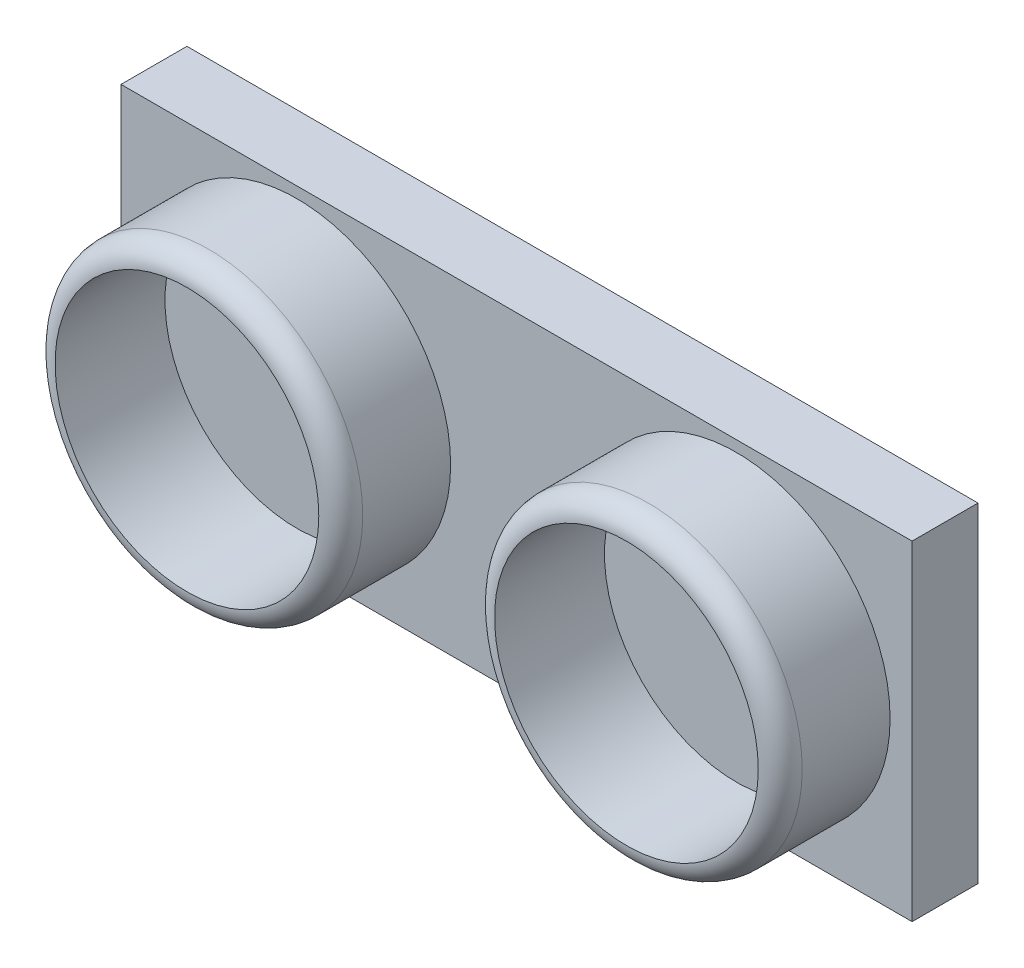
ISO-10303-21;
HEADER;
FILE_DESCRIPTION(('STEP AP214'),'2;1');
FILE_NAME('part.step','',(''),(''),'','','');
FILE_SCHEMA(('AUTOMOTIVE_DESIGN { 1 0 10303 214 1 1 1 1 }'));
ENDSEC;
DATA;
#1=APPLICATION_CONTEXT('core data for automotive mechanical design processes');
#2=APPLICATION_PROTOCOL_DEFINITION('international standard','automotive_design',2000,#1);
#3=PRODUCT_CONTEXT('',#1,'mechanical');
#4=PRODUCT('Part','Part','',(#3));
#5=PRODUCT_RELATED_PRODUCT_CATEGORY('part','',(#4));
#6=PRODUCT_DEFINITION_FORMATION('','',#4);
#7=PRODUCT_DEFINITION_CONTEXT('part definition',#1,'design');
#8=PRODUCT_DEFINITION('design','',#6,#7);
#9=PRODUCT_DEFINITION_SHAPE('','',#8);
#10=(LENGTH_UNIT() NAMED_UNIT(*) SI_UNIT(.MILLI.,.METRE.));
#11=(NAMED_UNIT(*) PLANE_ANGLE_UNIT() SI_UNIT($,.RADIAN.));
#12=(NAMED_UNIT(*) SI_UNIT($,.STERADIAN.) SOLID_ANGLE_UNIT());
#13=UNCERTAINTY_MEASURE_WITH_UNIT(LENGTH_MEASURE(1.E-05),#10,'distance_accuracy_value','');
#14=(GEOMETRIC_REPRESENTATION_CONTEXT(3) GLOBAL_UNCERTAINTY_ASSIGNED_CONTEXT((#13)) GLOBAL_UNIT_ASSIGNED_CONTEXT((#10,
#11,#12)) REPRESENTATION_CONTEXT('',''));
#15=CARTESIAN_POINT('',(0.,0.,0.));
#16=DIRECTION('',(0.,0.,1.));
#17=DIRECTION('',(1.,0.,0.));
#18=AXIS2_PLACEMENT_3D('',#15,#16,#17);
#19=CARTESIAN_POINT('',(18.,7.5,3.));
#20=DIRECTION('',(-1.,0.,0.));
#21=DIRECTION('',(0.,-1.,0.));
#22=AXIS2_PLACEMENT_3D('',#19,#20,#21);
#23=PLANE('',#22);
#24=DIRECTION('',(0.,1.,0.));
#25=VECTOR('',#24,1.);
#26=CARTESIAN_POINT('',(18.,7.5,0.));
#27=LINE('',#26,#25);
#28=CARTESIAN_POINT('',(18.,-7.5,0.));
#29=VERTEX_POINT('',#28);
#30=CARTESIAN_POINT('',(18.,7.5,0.));
#31=VERTEX_POINT('',#30);
#32=EDGE_CURVE('E107',#29,#31,#27,.T.);
#33=ORIENTED_EDGE('',*,*,#32,.T.);
#34=DIRECTION('',(0.,0.,-1.));
#35=VECTOR('',#34,1.);
#36=CARTESIAN_POINT('',(18.,7.5,3.));
#37=LINE('',#36,#35);
#38=CARTESIAN_POINT('',(18.,7.5,3.));
#39=VERTEX_POINT('',#38);
#40=EDGE_CURVE('E98',#39,#31,#37,.T.);
#41=ORIENTED_EDGE('',*,*,#40,.F.);
#42=DIRECTION('',(0.,1.,0.));
#43=VECTOR('',#42,1.);
#44=CARTESIAN_POINT('',(18.,7.5,3.));
#45=LINE('',#44,#43);
#46=CARTESIAN_POINT('',(18.,-7.5,3.));
#47=VERTEX_POINT('',#46);
#48=EDGE_CURVE('E92',#47,#39,#45,.T.);
#49=ORIENTED_EDGE('',*,*,#48,.F.);
#50=DIRECTION('',(0.,0.,-1.));
#51=VECTOR('',#50,1.);
#52=CARTESIAN_POINT('',(18.,-7.5,3.));
#53=LINE('',#52,#51);
#54=EDGE_CURVE('E103',#47,#29,#53,.T.);
#55=ORIENTED_EDGE('',*,*,#54,.T.);
#56=EDGE_LOOP('',(#33,#41,#49,#55));
#57=FACE_BOUND('',#56,.T.);
#58=ADVANCED_FACE('F39',(#57),#23,.F.);
#59=CARTESIAN_POINT('',(-18.,7.5,3.));
#60=DIRECTION('',(0.,-1.,0.));
#61=DIRECTION('',(0.,0.,-1.));
#62=AXIS2_PLACEMENT_3D('',#59,#60,#61);
#63=PLANE('',#62);
#64=DIRECTION('',(-1.,0.,0.));
#65=VECTOR('',#64,1.);
#66=CARTESIAN_POINT('',(-18.,7.5,0.));
#67=LINE('',#66,#65);
#68=CARTESIAN_POINT('',(-18.,7.5,0.));
#69=VERTEX_POINT('',#68);
#70=EDGE_CURVE('E97',#31,#69,#67,.T.);
#71=ORIENTED_EDGE('',*,*,#70,.T.);
#72=DIRECTION('',(0.,0.,-1.));
#73=VECTOR('',#72,1.);
#74=CARTESIAN_POINT('',(-18.,7.5,3.));
#75=LINE('',#74,#73);
#76=CARTESIAN_POINT('',(-18.,7.5,3.));
#77=VERTEX_POINT('',#76);
#78=EDGE_CURVE('E95',#77,#69,#75,.T.);
#79=ORIENTED_EDGE('',*,*,#78,.F.);
#80=DIRECTION('',(-1.,0.,0.));
#81=VECTOR('',#80,1.);
#82=CARTESIAN_POINT('',(-18.,7.5,3.));
#83=LINE('',#82,#81);
#84=EDGE_CURVE('E87',#39,#77,#83,.T.);
#85=ORIENTED_EDGE('',*,*,#84,.F.);
#86=ORIENTED_EDGE('',*,*,#40,.T.);
#87=EDGE_LOOP('',(#71,#79,#85,#86));
#88=FACE_BOUND('',#87,.T.);
#89=ADVANCED_FACE('F96',(#88),#63,.F.);
#90=CARTESIAN_POINT('',(-18.,7.5,3.));
#91=DIRECTION('',(1.,0.,0.));
#92=DIRECTION('',(0.,1.,0.));
#93=AXIS2_PLACEMENT_3D('',#90,#91,#92);
#94=PLANE('',#93);
#95=DIRECTION('',(0.,-1.,0.));
#96=VECTOR('',#95,1.);
#97=CARTESIAN_POINT('',(-18.,7.5,0.));
#98=LINE('',#97,#96);
#99=CARTESIAN_POINT('',(-18.,-7.5,0.));
#100=VERTEX_POINT('',#99);
#101=EDGE_CURVE('E73',#69,#100,#98,.T.);
#102=ORIENTED_EDGE('',*,*,#101,.T.);
#103=DIRECTION('',(0.,0.,-1.));
#104=VECTOR('',#103,1.);
#105=CARTESIAN_POINT('',(-18.,-7.5,3.));
#106=LINE('',#105,#104);
#107=CARTESIAN_POINT('',(-18.,-7.5,3.));
#108=VERTEX_POINT('',#107);
#109=EDGE_CURVE('E99',#108,#100,#106,.T.);
#110=ORIENTED_EDGE('',*,*,#109,.F.);
#111=DIRECTION('',(0.,-1.,0.));
#112=VECTOR('',#111,1.);
#113=CARTESIAN_POINT('',(-18.,7.5,3.));
#114=LINE('',#113,#112);
#115=EDGE_CURVE('E90',#77,#108,#114,.T.);
#116=ORIENTED_EDGE('',*,*,#115,.F.);
#117=ORIENTED_EDGE('',*,*,#78,.T.);
#118=EDGE_LOOP('',(#102,#110,#116,#117));
#119=FACE_BOUND('',#118,.T.);
#120=ADVANCED_FACE('F101',(#119),#94,.F.);
#121=CARTESIAN_POINT('',(-18.,-7.5,3.));
#122=DIRECTION('',(0.,1.,0.));
#123=DIRECTION('',(0.,0.,1.));
#124=AXIS2_PLACEMENT_3D('',#121,#122,#123);
#125=PLANE('',#124);
#126=DIRECTION('',(1.,0.,0.));
#127=VECTOR('',#126,1.);
#128=CARTESIAN_POINT('',(-18.,-7.5,0.));
#129=LINE('',#128,#127);
#130=EDGE_CURVE('E79',#100,#29,#129,.T.);
#131=ORIENTED_EDGE('',*,*,#130,.T.);
#132=ORIENTED_EDGE('',*,*,#54,.F.);
#133=DIRECTION('',(1.,0.,0.));
#134=VECTOR('',#133,1.);
#135=CARTESIAN_POINT('',(-18.,-7.5,3.));
#136=LINE('',#135,#134);
#137=EDGE_CURVE('E56',#108,#47,#136,.T.);
#138=ORIENTED_EDGE('',*,*,#137,.F.);
#139=ORIENTED_EDGE('',*,*,#109,.T.);
#140=EDGE_LOOP('',(#131,#132,#138,#139));
#141=FACE_BOUND('',#140,.T.);
#142=ADVANCED_FACE('F151',(#141),#125,.F.);
#143=CARTESIAN_POINT('',(0.,0.,3.));
#144=DIRECTION('',(0.,0.,1.));
#145=DIRECTION('',(1.,0.,0.));
#146=AXIS2_PLACEMENT_3D('',#143,#144,#145);
#147=PLANE('',#146);
#148=CARTESIAN_POINT('',(10.,0.,3.));
#149=DIRECTION('',(0.,0.,1.));
#150=DIRECTION('',(1.,0.,0.));
#151=AXIS2_PLACEMENT_3D('',#148,#149,#150);
#152=CIRCLE('',#151,7.);
#153=CARTESIAN_POINT('',(17.,0.,3.));
#154=VERTEX_POINT('',#153);
#155=EDGE_CURVE('E137',#154,#154,#152,.T.);
#156=ORIENTED_EDGE('',*,*,#155,.F.);
#157=EDGE_LOOP('',(#156));
#158=FACE_BOUND('',#157,.T.);
#159=CARTESIAN_POINT('',(-10.,0.,3.));
#160=DIRECTION('',(0.,0.,1.));
#161=DIRECTION('',(1.,0.,0.));
#162=AXIS2_PLACEMENT_3D('',#159,#160,#161);
#163=CIRCLE('',#162,7.);
#164=CARTESIAN_POINT('',(-3.,0.,3.));
#165=VERTEX_POINT('',#164);
#166=EDGE_CURVE('E110',#165,#165,#163,.T.);
#167=ORIENTED_EDGE('',*,*,#166,.F.);
#168=EDGE_LOOP('',(#167));
#169=FACE_BOUND('',#168,.T.);
#170=ORIENTED_EDGE('',*,*,#48,.T.);
#171=ORIENTED_EDGE('',*,*,#84,.T.);
#172=ORIENTED_EDGE('',*,*,#115,.T.);
#173=ORIENTED_EDGE('',*,*,#137,.T.);
#174=EDGE_LOOP('',(#170,#171,#172,#173));
#175=FACE_BOUND('',#174,.T.);
#176=ADVANCED_FACE('F88',(#158,#169,#175),#147,.T.);
#177=CARTESIAN_POINT('',(0.,0.,0.));
#178=DIRECTION('',(0.,0.,1.));
#179=DIRECTION('',(1.,0.,0.));
#180=AXIS2_PLACEMENT_3D('',#177,#178,#179);
#181=PLANE('',#180);
#182=ORIENTED_EDGE('',*,*,#32,.F.);
#183=ORIENTED_EDGE('',*,*,#130,.F.);
#184=ORIENTED_EDGE('',*,*,#101,.F.);
#185=ORIENTED_EDGE('',*,*,#70,.F.);
#186=EDGE_LOOP('',(#182,#183,#184,#185));
#187=FACE_BOUND('',#186,.T.);
#188=ADVANCED_FACE('F150',(#187),#181,.F.);
#189=CARTESIAN_POINT('',(-10.,0.,8.));
#190=DIRECTION('',(0.,0.,-1.));
#191=DIRECTION('',(-1.,0.,0.));
#192=AXIS2_PLACEMENT_3D('',#189,#190,#191);
#193=CYLINDRICAL_SURFACE('',#192,7.);
#194=CARTESIAN_POINT('',(-10.,0.,7.));
#195=DIRECTION('',(0.,0.,1.));
#196=DIRECTION('',(1.,0.,0.));
#197=AXIS2_PLACEMENT_3D('',#194,#195,#196);
#198=CIRCLE('',#197,7.);
#199=CARTESIAN_POINT('',(-3.,0.,7.));
#200=VERTEX_POINT('',#199);
#201=EDGE_CURVE('E11',#200,#200,#198,.F.);
#202=ORIENTED_EDGE('',*,*,#201,.T.);
#203=EDGE_LOOP('',(#202));
#204=FACE_BOUND('',#203,.T.);
#205=ORIENTED_EDGE('',*,*,#166,.T.);
#206=EDGE_LOOP('',(#205));
#207=FACE_BOUND('',#206,.T.);
#208=ADVANCED_FACE('F147',(#204,#207),#193,.T.);
#209=CARTESIAN_POINT('',(-10.,0.,8.));
#210=DIRECTION('',(0.,0.,-1.));
#211=DIRECTION('',(-1.,0.,0.));
#212=AXIS2_PLACEMENT_3D('',#209,#210,#211);
#213=CYLINDRICAL_SURFACE('',#212,6.);
#214=CARTESIAN_POINT('',(-10.,0.,8.));
#215=DIRECTION('',(0.,0.,1.));
#216=DIRECTION('',(1.,0.,0.));
#217=AXIS2_PLACEMENT_3D('',#214,#215,#216);
#218=CIRCLE('',#217,6.);
#219=CARTESIAN_POINT('',(-4.,0.,8.));
#220=VERTEX_POINT('',#219);
#221=EDGE_CURVE('E136',#220,#220,#218,.T.);
#222=ORIENTED_EDGE('',*,*,#221,.T.);
#223=EDGE_LOOP('',(#222));
#224=FACE_BOUND('',#223,.T.);
#225=CARTESIAN_POINT('',(-10.,0.,3.));
#226=DIRECTION('',(0.,0.,1.));
#227=DIRECTION('',(1.,0.,0.));
#228=AXIS2_PLACEMENT_3D('',#225,#226,#227);
#229=CIRCLE('',#228,6.);
#230=CARTESIAN_POINT('',(-4.,0.,3.));
#231=VERTEX_POINT('',#230);
#232=EDGE_CURVE('E117',#231,#231,#229,.F.);
#233=ORIENTED_EDGE('',*,*,#232,.T.);
#234=EDGE_LOOP('',(#233));
#235=FACE_BOUND('',#234,.T.);
#236=ADVANCED_FACE('F168',(#224,#235),#213,.F.);
#237=ORIENTED_EDGE('',*,*,#232,.F.);
#238=EDGE_LOOP('',(#237));
#239=FACE_BOUND('',#238,.T.);
#240=ADVANCED_FACE('F154',(#239),#147,.T.);
#241=CARTESIAN_POINT('',(10.,0.,8.));
#242=DIRECTION('',(0.,0.,-1.));
#243=DIRECTION('',(-1.,0.,0.));
#244=AXIS2_PLACEMENT_3D('',#241,#242,#243);
#245=CYLINDRICAL_SURFACE('',#244,7.);
#246=CARTESIAN_POINT('',(10.,0.,7.));
#247=DIRECTION('',(0.,0.,1.));
#248=DIRECTION('',(1.,0.,0.));
#249=AXIS2_PLACEMENT_3D('',#246,#247,#248);
#250=CIRCLE('',#249,7.);
#251=CARTESIAN_POINT('',(17.,0.,7.));
#252=VERTEX_POINT('',#251);
#253=EDGE_CURVE('E48',#252,#252,#250,.F.);
#254=ORIENTED_EDGE('',*,*,#253,.T.);
#255=EDGE_LOOP('',(#254));
#256=FACE_BOUND('',#255,.T.);
#257=ORIENTED_EDGE('',*,*,#155,.T.);
#258=EDGE_LOOP('',(#257));
#259=FACE_BOUND('',#258,.T.);
#260=ADVANCED_FACE('F125',(#256,#259),#245,.T.);
#261=CARTESIAN_POINT('',(10.,0.,8.));
#262=DIRECTION('',(0.,0.,-1.));
#263=DIRECTION('',(-1.,0.,0.));
#264=AXIS2_PLACEMENT_3D('',#261,#262,#263);
#265=CYLINDRICAL_SURFACE('',#264,6.);
#266=CARTESIAN_POINT('',(10.,0.,8.));
#267=DIRECTION('',(0.,0.,1.));
#268=DIRECTION('',(1.,0.,0.));
#269=AXIS2_PLACEMENT_3D('',#266,#267,#268);
#270=CIRCLE('',#269,6.);
#271=CARTESIAN_POINT('',(16.,0.,8.));
#272=VERTEX_POINT('',#271);
#273=EDGE_CURVE('E134',#272,#272,#270,.T.);
#274=ORIENTED_EDGE('',*,*,#273,.T.);
#275=EDGE_LOOP('',(#274));
#276=FACE_BOUND('',#275,.T.);
#277=CARTESIAN_POINT('',(10.,0.,3.));
#278=DIRECTION('',(0.,0.,1.));
#279=DIRECTION('',(1.,0.,0.));
#280=AXIS2_PLACEMENT_3D('',#277,#278,#279);
#281=CIRCLE('',#280,6.);
#282=CARTESIAN_POINT('',(16.,0.,3.));
#283=VERTEX_POINT('',#282);
#284=EDGE_CURVE('E120',#283,#283,#281,.F.);
#285=ORIENTED_EDGE('',*,*,#284,.T.);
#286=EDGE_LOOP('',(#285));
#287=FACE_BOUND('',#286,.T.);
#288=ADVANCED_FACE('F165',(#276,#287),#265,.F.);
#289=ORIENTED_EDGE('',*,*,#284,.F.);
#290=EDGE_LOOP('',(#289));
#291=FACE_BOUND('',#290,.T.);
#292=ADVANCED_FACE('F131',(#291),#147,.T.);
#293=CARTESIAN_POINT('',(10.,0.,7.));
#294=DIRECTION('',(0.,0.,1.));
#295=DIRECTION('',(1.,0.,0.));
#296=AXIS2_PLACEMENT_3D('',#293,#294,#295);
#297=TOROIDAL_SURFACE('',#296,6.,1.);
#298=ORIENTED_EDGE('',*,*,#253,.F.);
#299=EDGE_LOOP('',(#298));
#300=FACE_BOUND('',#299,.T.);
#301=ORIENTED_EDGE('',*,*,#273,.F.);
#302=EDGE_LOOP('',(#301));
#303=FACE_BOUND('',#302,.T.);
#304=ADVANCED_FACE('F128',(#300,#303),#297,.T.);
#305=CARTESIAN_POINT('',(-10.,0.,7.));
#306=DIRECTION('',(0.,0.,1.));
#307=DIRECTION('',(1.,0.,0.));
#308=AXIS2_PLACEMENT_3D('',#305,#306,#307);
#309=TOROIDAL_SURFACE('',#308,6.,1.);
#310=ORIENTED_EDGE('',*,*,#201,.F.);
#311=EDGE_LOOP('',(#310));
#312=FACE_BOUND('',#311,.T.);
#313=ORIENTED_EDGE('',*,*,#221,.F.);
#314=EDGE_LOOP('',(#313));
#315=FACE_BOUND('',#314,.T.);
#316=ADVANCED_FACE('F41',(#312,#315),#309,.T.);
#317=CLOSED_SHELL('',(#58,#89,#120,#142,#176,#188,#208,#236,#240,#260,#288,#292,#304,#316));
#318=MANIFOLD_SOLID_BREP('B2',#317);
#319=ADVANCED_BREP_SHAPE_REPRESENTATION('',(#18,#318),#14);
#320=SHAPE_DEFINITION_REPRESENTATION(#9,#319);
ENDSEC;
END-ISO-10303-21;
